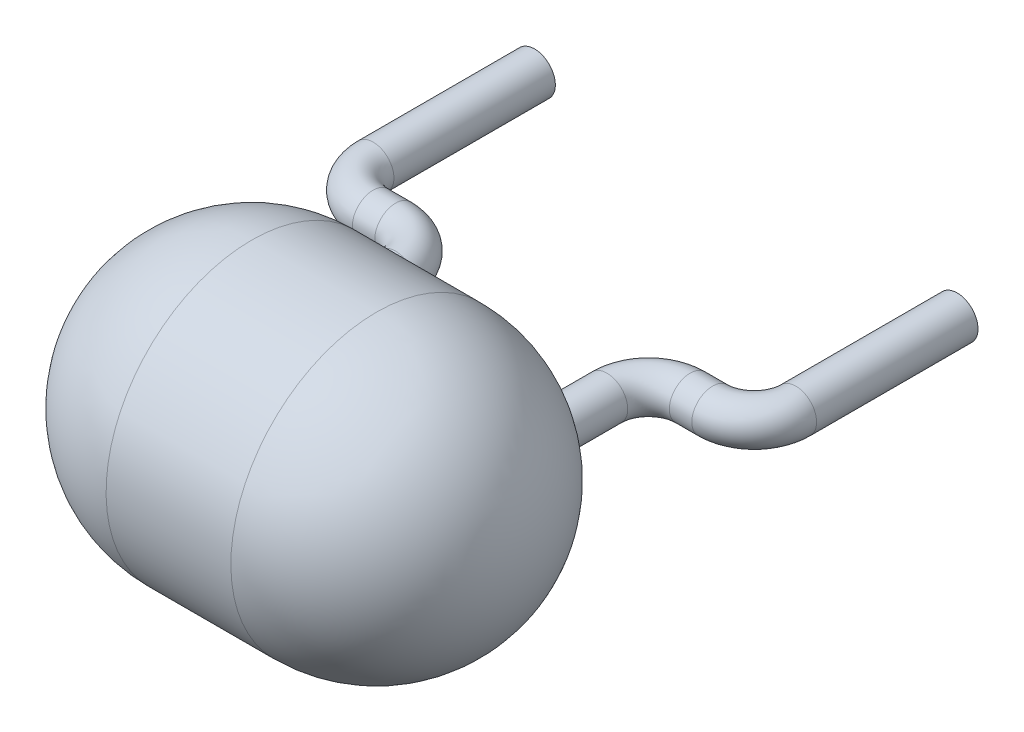
ISO-10303-21;
HEADER;
FILE_DESCRIPTION(('STEP AP214'),'2;1');
FILE_NAME('part.step','',(''),(''),'','','');
FILE_SCHEMA(('AUTOMOTIVE_DESIGN { 1 0 10303 214 1 1 1 1 }'));
ENDSEC;
DATA;
#1=APPLICATION_CONTEXT('core data for automotive mechanical design processes');
#2=APPLICATION_PROTOCOL_DEFINITION('international standard','automotive_design',2000,#1);
#3=PRODUCT_CONTEXT('',#1,'mechanical');
#4=PRODUCT('Part','Part','',(#3));
#5=PRODUCT_RELATED_PRODUCT_CATEGORY('part','',(#4));
#6=PRODUCT_DEFINITION_FORMATION('','',#4);
#7=PRODUCT_DEFINITION_CONTEXT('part definition',#1,'design');
#8=PRODUCT_DEFINITION('design','',#6,#7);
#9=PRODUCT_DEFINITION_SHAPE('','',#8);
#10=(LENGTH_UNIT() NAMED_UNIT(*) SI_UNIT(.MILLI.,.METRE.));
#11=(NAMED_UNIT(*) PLANE_ANGLE_UNIT() SI_UNIT($,.RADIAN.));
#12=(NAMED_UNIT(*) SI_UNIT($,.STERADIAN.) SOLID_ANGLE_UNIT());
#13=UNCERTAINTY_MEASURE_WITH_UNIT(LENGTH_MEASURE(1.E-05),#10,'distance_accuracy_value','');
#14=(GEOMETRIC_REPRESENTATION_CONTEXT(3) GLOBAL_UNCERTAINTY_ASSIGNED_CONTEXT((#13)) GLOBAL_UNIT_ASSIGNED_CONTEXT((#10,
#11,#12)) REPRESENTATION_CONTEXT('',''));
#15=CARTESIAN_POINT('',(0.,0.,0.));
#16=DIRECTION('',(0.,0.,1.));
#17=DIRECTION('',(1.,0.,0.));
#18=AXIS2_PLACEMENT_3D('',#15,#16,#17);
#19=CARTESIAN_POINT('',(1.27,-4.867218E-13,2.53));
#20=DIRECTION('',(-2.184065E-13,0.,-1.));
#21=DIRECTION('',(-1.,0.,2.184065E-13));
#22=AXIS2_PLACEMENT_3D('',#19,#20,#21);
#23=PLANE('',#22);
#24=CARTESIAN_POINT('',(1.27000000000033,0.,2.52999999999995));
#25=DIRECTION('',(2.184065E-13,0.,1.));
#26=DIRECTION('',(1.,0.,-2.184065E-13));
#27=AXIS2_PLACEMENT_3D('',#24,#25,#26);
#28=CIRCLE('',#27,0.25);
#29=CARTESIAN_POINT('',(1.52000000000033,0.,2.52999999999989));
#30=VERTEX_POINT('',#29);
#31=EDGE_CURVE('P0_E25',#30,#30,#28,.F.);
#32=ORIENTED_EDGE('',*,*,#31,.F.);
#33=EDGE_LOOP('',(#32));
#34=FACE_BOUND('',#33,.T.);
#35=ADVANCED_FACE('P0_F22',(#34),#23,.F.);
#36=CARTESIAN_POINT('',(1.27,0.,1.));
#37=DIRECTION('',(2.184065E-13,0.,1.));
#38=DIRECTION('',(1.,0.,-2.184065E-13));
#39=AXIS2_PLACEMENT_3D('',#36,#37,#38);
#40=CYLINDRICAL_SURFACE('',#39,0.25);
#41=CARTESIAN_POINT('',(1.27,0.,1.));
#42=DIRECTION('',(0.,0.,1.));
#43=DIRECTION('',(-1.,0.,0.));
#44=AXIS2_PLACEMENT_3D('',#41,#42,#43);
#45=CIRCLE('',#44,0.25);
#46=CARTESIAN_POINT('',(1.02,0.,1.));
#47=VERTEX_POINT('',#46);
#48=EDGE_CURVE('P0_E86',#47,#47,#45,.F.);
#49=ORIENTED_EDGE('',*,*,#48,.F.);
#50=EDGE_LOOP('',(#49));
#51=FACE_BOUND('',#50,.T.);
#52=ORIENTED_EDGE('',*,*,#31,.T.);
#53=EDGE_LOOP('',(#52));
#54=FACE_BOUND('',#53,.T.);
#55=ADVANCED_FACE('P0_F49',(#51,#54),#40,.T.);
#56=CARTESIAN_POINT('',(1.77,0.,1.));
#57=DIRECTION('',(0.,1.,0.));
#58=DIRECTION('',(-1.,0.,0.));
#59=AXIS2_PLACEMENT_3D('',#56,#57,#58);
#60=TOROIDAL_SURFACE('',#59,0.5,0.25);
#61=ORIENTED_EDGE('',*,*,#48,.T.);
#62=EDGE_LOOP('',(#61));
#63=FACE_BOUND('',#62,.T.);
#64=CARTESIAN_POINT('',(1.77,0.,0.5));
#65=DIRECTION('',(-1.,0.,0.));
#66=DIRECTION('',(0.,0.,1.));
#67=AXIS2_PLACEMENT_3D('',#64,#65,#66);
#68=CIRCLE('',#67,0.25);
#69=CARTESIAN_POINT('',(1.77,0.,0.75));
#70=VERTEX_POINT('',#69);
#71=EDGE_CURVE('P0_E40',#70,#70,#68,.F.);
#72=ORIENTED_EDGE('',*,*,#71,.F.);
#73=EDGE_LOOP('',(#72));
#74=FACE_BOUND('',#73,.T.);
#75=ADVANCED_FACE('P0_F45',(#63,#74),#60,.T.);
#76=CARTESIAN_POINT('',(2.04,0.,0.5));
#77=DIRECTION('',(-1.,0.,0.));
#78=DIRECTION('',(0.,0.,1.));
#79=AXIS2_PLACEMENT_3D('',#76,#77,#78);
#80=CYLINDRICAL_SURFACE('',#79,0.25);
#81=CARTESIAN_POINT('',(2.04,0.,0.5));
#82=DIRECTION('',(-1.,0.,0.));
#83=DIRECTION('',(0.,0.,1.));
#84=AXIS2_PLACEMENT_3D('',#81,#82,#83);
#85=CIRCLE('',#84,0.25);
#86=CARTESIAN_POINT('',(2.04,0.,0.75));
#87=VERTEX_POINT('',#86);
#88=EDGE_CURVE('P0_E34',#87,#87,#85,.F.);
#89=ORIENTED_EDGE('',*,*,#88,.F.);
#90=EDGE_LOOP('',(#89));
#91=FACE_BOUND('',#90,.T.);
#92=ORIENTED_EDGE('',*,*,#71,.T.);
#93=EDGE_LOOP('',(#92));
#94=FACE_BOUND('',#93,.T.);
#95=ADVANCED_FACE('P0_F48',(#91,#94),#80,.T.);
#96=CARTESIAN_POINT('',(2.54,0.,-1.94));
#97=DIRECTION('',(0.,0.,-1.));
#98=DIRECTION('',(-1.,0.,0.));
#99=AXIS2_PLACEMENT_3D('',#96,#97,#98);
#100=PLANE('',#99);
#101=CARTESIAN_POINT('',(2.54,0.,-1.94000000000001));
#102=DIRECTION('',(0.,0.,1.));
#103=DIRECTION('',(1.,0.,0.));
#104=AXIS2_PLACEMENT_3D('',#101,#102,#103);
#105=CIRCLE('',#104,0.25);
#106=CARTESIAN_POINT('',(2.79,0.,-1.94));
#107=VERTEX_POINT('',#106);
#108=EDGE_CURVE('P0_E29',#107,#107,#105,.T.);
#109=ORIENTED_EDGE('',*,*,#108,.F.);
#110=EDGE_LOOP('',(#109));
#111=FACE_BOUND('',#110,.T.);
#112=ADVANCED_FACE('P0_F69',(#111),#100,.T.);
#113=CARTESIAN_POINT('',(2.04,0.,0.));
#114=DIRECTION('',(0.,-1.,0.));
#115=DIRECTION('',(1.,0.,0.));
#116=AXIS2_PLACEMENT_3D('',#113,#114,#115);
#117=TOROIDAL_SURFACE('',#116,0.5,0.25);
#118=CARTESIAN_POINT('',(2.53999999999994,0.,0.));
#119=DIRECTION('',(0.,0.,1.));
#120=DIRECTION('',(1.,0.,0.));
#121=AXIS2_PLACEMENT_3D('',#118,#119,#120);
#122=CIRCLE('',#121,0.25);
#123=CARTESIAN_POINT('',(2.78999999999994,0.,0.));
#124=VERTEX_POINT('',#123);
#125=EDGE_CURVE('P0_E12',#124,#124,#122,.F.);
#126=ORIENTED_EDGE('',*,*,#125,.F.);
#127=EDGE_LOOP('',(#126));
#128=FACE_BOUND('',#127,.T.);
#129=ORIENTED_EDGE('',*,*,#88,.T.);
#130=EDGE_LOOP('',(#129));
#131=FACE_BOUND('',#130,.T.);
#132=ADVANCED_FACE('P0_F63',(#128,#131),#117,.T.);
#133=CARTESIAN_POINT('',(2.54,0.,-1.94));
#134=DIRECTION('',(0.,0.,1.));
#135=DIRECTION('',(1.,0.,0.));
#136=AXIS2_PLACEMENT_3D('',#133,#134,#135);
#137=CYLINDRICAL_SURFACE('',#136,0.25);
#138=ORIENTED_EDGE('',*,*,#108,.T.);
#139=EDGE_LOOP('',(#138));
#140=FACE_BOUND('',#139,.T.);
#141=ORIENTED_EDGE('',*,*,#125,.T.);
#142=EDGE_LOOP('',(#141));
#143=FACE_BOUND('',#142,.T.);
#144=ADVANCED_FACE('P0_F61',(#140,#143),#137,.T.);
#145=CLOSED_SHELL('',(#35,#55,#75,#95,#112,#132,#144));
#146=MANIFOLD_SOLID_BREP('P0_B1',#145);
#147=CARTESIAN_POINT('',(-1.52,-0.255,2.53));
#148=DIRECTION('',(0.,0.,-1.));
#149=DIRECTION('',(0.,1.,0.));
#150=AXIS2_PLACEMENT_3D('',#147,#148,#149);
#151=PLANE('',#150);
#152=CARTESIAN_POINT('',(-1.27,0.,2.53));
#153=DIRECTION('',(0.,0.,1.));
#154=DIRECTION('',(1.,0.,0.));
#155=AXIS2_PLACEMENT_3D('',#152,#153,#154);
#156=CIRCLE('',#155,0.250000000000009);
#157=CARTESIAN_POINT('',(-1.01999999999999,0.,2.53));
#158=VERTEX_POINT('',#157);
#159=EDGE_CURVE('P1_E26',#158,#158,#156,.F.);
#160=ORIENTED_EDGE('',*,*,#159,.F.);
#161=EDGE_LOOP('',(#160));
#162=FACE_BOUND('',#161,.T.);
#163=ADVANCED_FACE('P1_F22',(#162),#151,.F.);
#164=CARTESIAN_POINT('',(-1.27,0.,1.));
#165=DIRECTION('',(0.,0.,1.));
#166=DIRECTION('',(1.,0.,0.));
#167=AXIS2_PLACEMENT_3D('',#164,#165,#166);
#168=CYLINDRICAL_SURFACE('',#167,0.250000000000009);
#169=CARTESIAN_POINT('',(-1.27,0.,1.));
#170=DIRECTION('',(0.,0.,-1.));
#171=DIRECTION('',(-1.,0.,0.));
#172=AXIS2_PLACEMENT_3D('',#169,#170,#171);
#173=CIRCLE('',#172,0.250000000000009);
#174=CARTESIAN_POINT('',(-1.01999999999999,0.,1.));
#175=VERTEX_POINT('',#174);
#176=EDGE_CURVE('P1_E42',#175,#175,#173,.T.);
#177=ORIENTED_EDGE('',*,*,#176,.F.);
#178=EDGE_LOOP('',(#177));
#179=FACE_BOUND('',#178,.T.);
#180=ORIENTED_EDGE('',*,*,#159,.T.);
#181=EDGE_LOOP('',(#180));
#182=FACE_BOUND('',#181,.T.);
#183=ADVANCED_FACE('P1_F49',(#179,#182),#168,.T.);
#184=CARTESIAN_POINT('',(-1.77,0.,1.));
#185=DIRECTION('',(0.,-1.,0.));
#186=DIRECTION('',(1.,0.,0.));
#187=AXIS2_PLACEMENT_3D('',#184,#185,#186);
#188=TOROIDAL_SURFACE('',#187,0.5,0.250000000000009);
#189=CARTESIAN_POINT('',(-1.77,0.,0.5));
#190=DIRECTION('',(-1.,0.,0.));
#191=DIRECTION('',(0.,0.,1.));
#192=AXIS2_PLACEMENT_3D('',#189,#190,#191);
#193=CIRCLE('',#192,0.250000000000009);
#194=CARTESIAN_POINT('',(-1.77,0.,0.249999999999991));
#195=VERTEX_POINT('',#194);
#196=EDGE_CURVE('P1_E39',#195,#195,#193,.T.);
#197=CARTESIAN_POINT('',(-1.77,0.,1.));
#198=DIRECTION('',(0.,-1.,0.));
#199=DIRECTION('',(1.,0.,0.));
#200=AXIS2_PLACEMENT_3D('',#197,#198,#199);
#201=CIRCLE('',#200,0.750000000000009);
#202=EDGE_CURVE('',#195,#175,#201,.T.);
#203=ORIENTED_EDGE('',*,*,#196,.F.);
#204=ORIENTED_EDGE('',*,*,#176,.T.);
#205=ORIENTED_EDGE('',*,*,#202,.T.);
#206=ORIENTED_EDGE('',*,*,#202,.F.);
#207=EDGE_LOOP('',(#203,#205,#204,#206));
#208=FACE_BOUND('',#207,.T.);
#209=ADVANCED_FACE('P1_F57',(#208),#188,.T.);
#210=CARTESIAN_POINT('',(-2.04,0.,0.5));
#211=DIRECTION('',(1.,0.,0.));
#212=DIRECTION('',(0.,0.,-1.));
#213=AXIS2_PLACEMENT_3D('',#210,#211,#212);
#214=CYLINDRICAL_SURFACE('',#213,0.250000000000009);
#215=CARTESIAN_POINT('',(-2.04,0.,0.5));
#216=DIRECTION('',(-1.,0.,0.));
#217=DIRECTION('',(0.,0.,1.));
#218=AXIS2_PLACEMENT_3D('',#215,#216,#217);
#219=CIRCLE('',#218,0.250000000000009);
#220=CARTESIAN_POINT('',(-2.04,0.,0.750000000000009));
#221=VERTEX_POINT('',#220);
#222=EDGE_CURVE('P1_E35',#221,#221,#219,.T.);
#223=ORIENTED_EDGE('',*,*,#222,.F.);
#224=EDGE_LOOP('',(#223));
#225=FACE_BOUND('',#224,.T.);
#226=ORIENTED_EDGE('',*,*,#196,.T.);
#227=EDGE_LOOP('',(#226));
#228=FACE_BOUND('',#227,.T.);
#229=ADVANCED_FACE('P1_F71',(#225,#228),#214,.T.);
#230=CARTESIAN_POINT('',(-2.79,-0.255,-1.94));
#231=DIRECTION('',(0.,0.,-1.));
#232=DIRECTION('',(0.,1.,0.));
#233=AXIS2_PLACEMENT_3D('',#230,#231,#232);
#234=PLANE('',#233);
#235=CARTESIAN_POINT('',(-2.54,0.,-1.94));
#236=DIRECTION('',(0.,0.,1.));
#237=DIRECTION('',(1.,0.,0.));
#238=AXIS2_PLACEMENT_3D('',#235,#236,#237);
#239=CIRCLE('',#238,0.250000000000009);
#240=CARTESIAN_POINT('',(-2.28999999999999,0.,-1.94));
#241=VERTEX_POINT('',#240);
#242=EDGE_CURVE('P1_E30',#241,#241,#239,.T.);
#243=ORIENTED_EDGE('',*,*,#242,.F.);
#244=EDGE_LOOP('',(#243));
#245=FACE_BOUND('',#244,.T.);
#246=ADVANCED_FACE('P1_F66',(#245),#234,.T.);
#247=CARTESIAN_POINT('',(-2.04,0.,0.));
#248=DIRECTION('',(0.,1.,0.));
#249=DIRECTION('',(-1.,0.,0.));
#250=AXIS2_PLACEMENT_3D('',#247,#248,#249);
#251=TOROIDAL_SURFACE('',#250,0.5,0.250000000000009);
#252=CARTESIAN_POINT('',(-2.54,0.,0.));
#253=DIRECTION('',(0.,0.,-1.));
#254=DIRECTION('',(-1.,0.,0.));
#255=AXIS2_PLACEMENT_3D('',#252,#253,#254);
#256=CIRCLE('',#255,0.250000000000009);
#257=CARTESIAN_POINT('',(-2.79000000000001,0.,0.));
#258=VERTEX_POINT('',#257);
#259=EDGE_CURVE('P1_E12',#258,#258,#256,.T.);
#260=CARTESIAN_POINT('',(-2.04,0.,0.));
#261=DIRECTION('',(0.,1.,0.));
#262=DIRECTION('',(-1.,0.,0.));
#263=AXIS2_PLACEMENT_3D('',#260,#261,#262);
#264=CIRCLE('',#263,0.750000000000009);
#265=EDGE_CURVE('',#258,#221,#264,.T.);
#266=ORIENTED_EDGE('',*,*,#259,.F.);
#267=ORIENTED_EDGE('',*,*,#222,.T.);
#268=ORIENTED_EDGE('',*,*,#265,.T.);
#269=ORIENTED_EDGE('',*,*,#265,.F.);
#270=EDGE_LOOP('',(#266,#268,#267,#269));
#271=FACE_BOUND('',#270,.T.);
#272=ADVANCED_FACE('P1_F61',(#271),#251,.T.);
#273=CARTESIAN_POINT('',(-2.54,0.,-1.94));
#274=DIRECTION('',(0.,0.,1.));
#275=DIRECTION('',(1.,0.,0.));
#276=AXIS2_PLACEMENT_3D('',#273,#274,#275);
#277=CYLINDRICAL_SURFACE('',#276,0.250000000000009);
#278=ORIENTED_EDGE('',*,*,#242,.T.);
#279=EDGE_LOOP('',(#278));
#280=FACE_BOUND('',#279,.T.);
#281=ORIENTED_EDGE('',*,*,#259,.T.);
#282=EDGE_LOOP('',(#281));
#283=FACE_BOUND('',#282,.T.);
#284=ADVANCED_FACE('P1_F24',(#280,#283),#277,.T.);
#285=CLOSED_SHELL('',(#163,#183,#209,#229,#246,#272,#284));
#286=MANIFOLD_SOLID_BREP('P1_B1',#285);
#287=CARTESIAN_POINT('',(0.75,0.,3.25));
#288=DIRECTION('',(1.,0.,0.));
#289=DIRECTION('',(0.,1.,0.));
#290=AXIS2_PLACEMENT_3D('',#287,#288,#289);
#291=SPHERICAL_SURFACE('',#290,1.75);
#292=CARTESIAN_POINT('',(2.5,0.,3.25));
#293=VERTEX_POINT('',#292);
#294=VERTEX_LOOP('',#293);
#295=FACE_BOUND('',#294,.T.);
#296=CARTESIAN_POINT('',(0.750000000000001,0.,3.25));
#297=DIRECTION('',(1.,0.,0.));
#298=DIRECTION('',(0.,1.,0.));
#299=AXIS2_PLACEMENT_3D('',#296,#297,#298);
#300=CIRCLE('',#299,1.75);
#301=CARTESIAN_POINT('',(0.750000000000002,1.75,3.25));
#302=VERTEX_POINT('',#301);
#303=EDGE_CURVE('P2_E28',#302,#302,#300,.F.);
#304=ORIENTED_EDGE('',*,*,#303,.F.);
#305=EDGE_LOOP('',(#304));
#306=FACE_BOUND('',#305,.T.);
#307=ADVANCED_FACE('P2_F24',(#295,#306),#291,.T.);
#308=CARTESIAN_POINT('',(-0.375,0.,3.25));
#309=DIRECTION('',(1.,0.,0.));
#310=DIRECTION('',(0.,1.,0.));
#311=AXIS2_PLACEMENT_3D('',#308,#309,#310);
#312=CYLINDRICAL_SURFACE('',#311,1.75);
#313=ORIENTED_EDGE('',*,*,#303,.T.);
#314=EDGE_LOOP('',(#313));
#315=FACE_BOUND('',#314,.T.);
#316=CARTESIAN_POINT('',(-0.75,0.,3.25));
#317=DIRECTION('',(1.,0.,0.));
#318=DIRECTION('',(0.,1.,0.));
#319=AXIS2_PLACEMENT_3D('',#316,#317,#318);
#320=CIRCLE('',#319,1.75);
#321=CARTESIAN_POINT('',(-0.75,1.75,3.25));
#322=VERTEX_POINT('',#321);
#323=EDGE_CURVE('P2_E13',#322,#322,#320,.F.);
#324=ORIENTED_EDGE('',*,*,#323,.F.);
#325=EDGE_LOOP('',(#324));
#326=FACE_BOUND('',#325,.T.);
#327=ADVANCED_FACE('P2_F40',(#315,#326),#312,.T.);
#328=CARTESIAN_POINT('',(-0.75,0.,3.25));
#329=DIRECTION('',(1.,0.,0.));
#330=DIRECTION('',(0.,1.,0.));
#331=AXIS2_PLACEMENT_3D('',#328,#329,#330);
#332=SPHERICAL_SURFACE('',#331,1.75);
#333=CARTESIAN_POINT('',(-2.5,0.,3.25));
#334=VERTEX_POINT('',#333);
#335=VERTEX_LOOP('',#334);
#336=FACE_BOUND('',#335,.T.);
#337=ORIENTED_EDGE('',*,*,#323,.T.);
#338=EDGE_LOOP('',(#337));
#339=FACE_BOUND('',#338,.T.);
#340=ADVANCED_FACE('P2_F46',(#336,#339),#332,.T.);
#341=CLOSED_SHELL('',(#307,#327,#340));
#342=MANIFOLD_SOLID_BREP('P2_B1',#341);
#343=ADVANCED_BREP_SHAPE_REPRESENTATION('',(#18,#146,#286,#342),#14);
#344=SHAPE_DEFINITION_REPRESENTATION(#9,#343);
ENDSEC;
END-ISO-10303-21;
